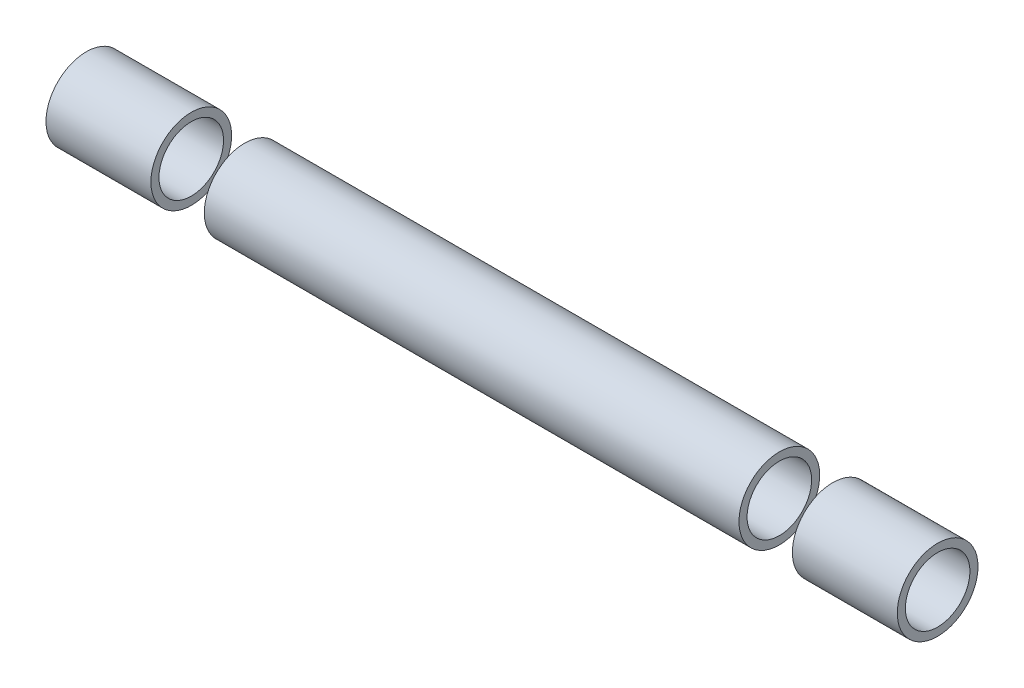
ISO-10303-21;
HEADER;
FILE_DESCRIPTION(('STEP AP214'),'2;1');
FILE_NAME('part.step','',(''),(''),'','','');
FILE_SCHEMA(('AUTOMOTIVE_DESIGN { 1 0 10303 214 1 1 1 1 }'));
ENDSEC;
DATA;
#1=APPLICATION_CONTEXT('core data for automotive mechanical design processes');
#2=APPLICATION_PROTOCOL_DEFINITION('international standard','automotive_design',2000,#1);
#3=PRODUCT_CONTEXT('',#1,'mechanical');
#4=PRODUCT('Part','Part','',(#3));
#5=PRODUCT_RELATED_PRODUCT_CATEGORY('part','',(#4));
#6=PRODUCT_DEFINITION_FORMATION('','',#4);
#7=PRODUCT_DEFINITION_CONTEXT('part definition',#1,'design');
#8=PRODUCT_DEFINITION('design','',#6,#7);
#9=PRODUCT_DEFINITION_SHAPE('','',#8);
#10=(LENGTH_UNIT() NAMED_UNIT(*) SI_UNIT(.MILLI.,.METRE.));
#11=(NAMED_UNIT(*) PLANE_ANGLE_UNIT() SI_UNIT($,.RADIAN.));
#12=(NAMED_UNIT(*) SI_UNIT($,.STERADIAN.) SOLID_ANGLE_UNIT());
#13=UNCERTAINTY_MEASURE_WITH_UNIT(LENGTH_MEASURE(1.E-05),#10,'distance_accuracy_value','');
#14=(GEOMETRIC_REPRESENTATION_CONTEXT(3) GLOBAL_UNCERTAINTY_ASSIGNED_CONTEXT((#13)) GLOBAL_UNIT_ASSIGNED_CONTEXT((#10,
#11,#12)) REPRESENTATION_CONTEXT('',''));
#15=CARTESIAN_POINT('',(0.,0.,0.));
#16=DIRECTION('',(0.,0.,1.));
#17=DIRECTION('',(1.,0.,0.));
#18=AXIS2_PLACEMENT_3D('',#15,#16,#17);
#19=CARTESIAN_POINT('',(167.4495,0.,0.));
#20=DIRECTION('',(-1.,0.,0.));
#21=DIRECTION('',(0.,0.,1.));
#22=AXIS2_PLACEMENT_3D('',#19,#20,#21);
#23=CYLINDRICAL_SURFACE('',#22,15.875);
#24=CARTESIAN_POINT('',(167.4495,0.,0.));
#25=DIRECTION('',(1.,0.,0.));
#26=DIRECTION('',(0.,0.,-1.));
#27=AXIS2_PLACEMENT_3D('',#24,#25,#26);
#28=CIRCLE('',#27,15.875);
#29=CARTESIAN_POINT('',(167.4495,0.,-15.875));
#30=VERTEX_POINT('',#29);
#31=EDGE_CURVE('E64',#30,#30,#28,.T.);
#32=ORIENTED_EDGE('',*,*,#31,.F.);
#33=EDGE_LOOP('',(#32));
#34=FACE_BOUND('',#33,.T.);
#35=CARTESIAN_POINT('',(126.1745,0.,0.));
#36=DIRECTION('',(1.,0.,0.));
#37=DIRECTION('',(0.,0.,-1.));
#38=AXIS2_PLACEMENT_3D('',#35,#36,#37);
#39=CIRCLE('',#38,15.875);
#40=CARTESIAN_POINT('',(126.1745,0.,-15.875));
#41=VERTEX_POINT('',#40);
#42=EDGE_CURVE('E55',#41,#41,#39,.T.);
#43=ORIENTED_EDGE('',*,*,#42,.T.);
#44=EDGE_LOOP('',(#43));
#45=FACE_BOUND('',#44,.T.);
#46=ADVANCED_FACE('F52',(#34,#45),#23,.T.);
#47=CARTESIAN_POINT('',(167.4495,0.,0.));
#48=DIRECTION('',(1.,0.,0.));
#49=DIRECTION('',(0.,0.,-1.));
#50=AXIS2_PLACEMENT_3D('',#47,#48,#49);
#51=PLANE('',#50);
#52=ORIENTED_EDGE('',*,*,#31,.T.);
#53=EDGE_LOOP('',(#52));
#54=FACE_BOUND('',#53,.T.);
#55=CARTESIAN_POINT('',(167.4495,0.,0.));
#56=DIRECTION('',(1.,0.,0.));
#57=DIRECTION('',(0.,0.,-1.));
#58=AXIS2_PLACEMENT_3D('',#55,#56,#57);
#59=CIRCLE('',#58,12.7);
#60=CARTESIAN_POINT('',(167.4495,0.,-12.7));
#61=VERTEX_POINT('',#60);
#62=EDGE_CURVE('E59',#61,#61,#59,.T.);
#63=ORIENTED_EDGE('',*,*,#62,.F.);
#64=EDGE_LOOP('',(#63));
#65=FACE_BOUND('',#64,.T.);
#66=ADVANCED_FACE('F80',(#54,#65),#51,.T.);
#67=CARTESIAN_POINT('',(167.4495,0.,0.));
#68=DIRECTION('',(-1.,0.,0.));
#69=DIRECTION('',(0.,0.,1.));
#70=AXIS2_PLACEMENT_3D('',#67,#68,#69);
#71=CYLINDRICAL_SURFACE('',#70,12.7);
#72=CARTESIAN_POINT('',(126.1745,0.,0.));
#73=DIRECTION('',(1.,0.,0.));
#74=DIRECTION('',(0.,0.,-1.));
#75=AXIS2_PLACEMENT_3D('',#72,#73,#74);
#76=CIRCLE('',#75,12.7);
#77=CARTESIAN_POINT('',(126.1745,0.,-12.7));
#78=VERTEX_POINT('',#77);
#79=EDGE_CURVE('E12',#78,#78,#76,.T.);
#80=ORIENTED_EDGE('',*,*,#79,.F.);
#81=EDGE_LOOP('',(#80));
#82=FACE_BOUND('',#81,.T.);
#83=ORIENTED_EDGE('',*,*,#62,.T.);
#84=EDGE_LOOP('',(#83));
#85=FACE_BOUND('',#84,.T.);
#86=ADVANCED_FACE('F75',(#82,#85),#71,.F.);
#87=CARTESIAN_POINT('',(126.1745,-15.875,-15.875));
#88=DIRECTION('',(1.,0.,0.));
#89=DIRECTION('',(0.,0.,-1.));
#90=AXIS2_PLACEMENT_3D('',#87,#88,#89);
#91=PLANE('',#90);
#92=ORIENTED_EDGE('',*,*,#79,.T.);
#93=EDGE_LOOP('',(#92));
#94=FACE_BOUND('',#93,.T.);
#95=ORIENTED_EDGE('',*,*,#42,.F.);
#96=EDGE_LOOP('',(#95));
#97=FACE_BOUND('',#96,.T.);
#98=ADVANCED_FACE('F73',(#94,#97),#91,.F.);
#99=CLOSED_SHELL('',(#46,#66,#86,#98));
#100=MANIFOLD_SOLID_BREP('B2',#99);
#101=CARTESIAN_POINT('',(167.4495,0.,0.));
#102=DIRECTION('',(-1.,0.,0.));
#103=DIRECTION('',(0.,0.,1.));
#104=AXIS2_PLACEMENT_3D('',#101,#102,#103);
#105=CYLINDRICAL_SURFACE('',#104,12.7);
#106=CARTESIAN_POINT('',(105.17450009,0.,0.));
#107=DIRECTION('',(-1.,0.,0.));
#108=DIRECTION('',(0.,-1.,0.));
#109=AXIS2_PLACEMENT_3D('',#106,#107,#108);
#110=CIRCLE('',#109,12.7);
#111=CARTESIAN_POINT('',(105.17450009,-12.7,0.));
#112=VERTEX_POINT('',#111);
#113=EDGE_CURVE('E140',#112,#112,#110,.T.);
#114=ORIENTED_EDGE('',*,*,#113,.F.);
#115=EDGE_LOOP('',(#114));
#116=FACE_BOUND('',#115,.T.);
#117=CARTESIAN_POINT('',(-105.17450009,0.,0.));
#118=DIRECTION('',(1.,0.,0.));
#119=DIRECTION('',(0.,1.,0.));
#120=AXIS2_PLACEMENT_3D('',#117,#118,#119);
#121=CIRCLE('',#120,12.7);
#122=CARTESIAN_POINT('',(-105.17450009,12.7,0.));
#123=VERTEX_POINT('',#122);
#124=EDGE_CURVE('E144',#123,#123,#121,.T.);
#125=ORIENTED_EDGE('',*,*,#124,.F.);
#126=EDGE_LOOP('',(#125));
#127=FACE_BOUND('',#126,.T.);
#128=ADVANCED_FACE('F129',(#116,#127),#105,.F.);
#129=CARTESIAN_POINT('',(-105.17450009,-15.875,-15.875));
#130=DIRECTION('',(1.,0.,0.));
#131=DIRECTION('',(0.,1.,0.));
#132=AXIS2_PLACEMENT_3D('',#129,#130,#131);
#133=PLANE('',#132);
#134=ORIENTED_EDGE('',*,*,#124,.T.);
#135=EDGE_LOOP('',(#134));
#136=FACE_BOUND('',#135,.T.);
#137=CARTESIAN_POINT('',(-105.17450009,0.,0.));
#138=DIRECTION('',(1.,0.,0.));
#139=DIRECTION('',(0.,1.,0.));
#140=AXIS2_PLACEMENT_3D('',#137,#138,#139);
#141=CIRCLE('',#140,15.875);
#142=CARTESIAN_POINT('',(-105.17450009,15.875,0.));
#143=VERTEX_POINT('',#142);
#144=EDGE_CURVE('E51',#143,#143,#141,.T.);
#145=ORIENTED_EDGE('',*,*,#144,.F.);
#146=EDGE_LOOP('',(#145));
#147=FACE_BOUND('',#146,.T.);
#148=ADVANCED_FACE('F150',(#136,#147),#133,.F.);
#149=CARTESIAN_POINT('',(105.17450009,-15.875,-15.875));
#150=DIRECTION('',(-1.,0.,0.));
#151=DIRECTION('',(0.,-1.,0.));
#152=AXIS2_PLACEMENT_3D('',#149,#150,#151);
#153=PLANE('',#152);
#154=ORIENTED_EDGE('',*,*,#113,.T.);
#155=EDGE_LOOP('',(#154));
#156=FACE_BOUND('',#155,.T.);
#157=CARTESIAN_POINT('',(105.17450009,0.,0.));
#158=DIRECTION('',(-1.,0.,0.));
#159=DIRECTION('',(0.,-1.,0.));
#160=AXIS2_PLACEMENT_3D('',#157,#158,#159);
#161=CIRCLE('',#160,15.875);
#162=CARTESIAN_POINT('',(105.17450009,-15.875,0.));
#163=VERTEX_POINT('',#162);
#164=EDGE_CURVE('E136',#163,#163,#161,.T.);
#165=ORIENTED_EDGE('',*,*,#164,.F.);
#166=EDGE_LOOP('',(#165));
#167=FACE_BOUND('',#166,.T.);
#168=ADVANCED_FACE('F158',(#156,#167),#153,.F.);
#169=CARTESIAN_POINT('',(167.4495,0.,0.));
#170=DIRECTION('',(-1.,0.,0.));
#171=DIRECTION('',(0.,0.,1.));
#172=AXIS2_PLACEMENT_3D('',#169,#170,#171);
#173=CYLINDRICAL_SURFACE('',#172,15.875);
#174=ORIENTED_EDGE('',*,*,#164,.T.);
#175=EDGE_LOOP('',(#174));
#176=FACE_BOUND('',#175,.T.);
#177=ORIENTED_EDGE('',*,*,#144,.T.);
#178=EDGE_LOOP('',(#177));
#179=FACE_BOUND('',#178,.T.);
#180=ADVANCED_FACE('F131',(#176,#179),#173,.T.);
#181=CLOSED_SHELL('',(#128,#148,#168,#180));
#182=MANIFOLD_SOLID_BREP('B7',#181);
#183=CARTESIAN_POINT('',(167.4495,0.,0.));
#184=DIRECTION('',(-1.,0.,0.));
#185=DIRECTION('',(0.,0.,1.));
#186=AXIS2_PLACEMENT_3D('',#183,#184,#185);
#187=CYLINDRICAL_SURFACE('',#186,15.875);
#188=CARTESIAN_POINT('',(-126.1745,0.,0.));
#189=DIRECTION('',(-1.,0.,0.));
#190=DIRECTION('',(0.,0.,1.));
#191=AXIS2_PLACEMENT_3D('',#188,#189,#190);
#192=CIRCLE('',#191,15.875);
#193=CARTESIAN_POINT('',(-126.1745,0.,15.875));
#194=VERTEX_POINT('',#193);
#195=EDGE_CURVE('E210',#194,#194,#192,.T.);
#196=ORIENTED_EDGE('',*,*,#195,.T.);
#197=EDGE_LOOP('',(#196));
#198=FACE_BOUND('',#197,.T.);
#199=CARTESIAN_POINT('',(-167.4495,0.,0.));
#200=DIRECTION('',(1.,0.,0.));
#201=DIRECTION('',(0.,0.,-1.));
#202=AXIS2_PLACEMENT_3D('',#199,#200,#201);
#203=CIRCLE('',#202,15.875);
#204=CARTESIAN_POINT('',(-167.4495,0.,-15.875));
#205=VERTEX_POINT('',#204);
#206=EDGE_CURVE('E128',#205,#205,#203,.T.);
#207=ORIENTED_EDGE('',*,*,#206,.T.);
#208=EDGE_LOOP('',(#207));
#209=FACE_BOUND('',#208,.T.);
#210=ADVANCED_FACE('F199',(#198,#209),#187,.T.);
#211=CARTESIAN_POINT('',(-167.4495,0.,0.));
#212=DIRECTION('',(1.,0.,0.));
#213=DIRECTION('',(0.,0.,-1.));
#214=AXIS2_PLACEMENT_3D('',#211,#212,#213);
#215=PLANE('',#214);
#216=ORIENTED_EDGE('',*,*,#206,.F.);
#217=EDGE_LOOP('',(#216));
#218=FACE_BOUND('',#217,.T.);
#219=CARTESIAN_POINT('',(-167.4495,0.,0.));
#220=DIRECTION('',(1.,0.,0.));
#221=DIRECTION('',(0.,0.,-1.));
#222=AXIS2_PLACEMENT_3D('',#219,#220,#221);
#223=CIRCLE('',#222,12.7);
#224=CARTESIAN_POINT('',(-167.4495,0.,-12.7));
#225=VERTEX_POINT('',#224);
#226=EDGE_CURVE('E206',#225,#225,#223,.T.);
#227=ORIENTED_EDGE('',*,*,#226,.T.);
#228=EDGE_LOOP('',(#227));
#229=FACE_BOUND('',#228,.T.);
#230=ADVANCED_FACE('F225',(#218,#229),#215,.F.);
#231=CARTESIAN_POINT('',(167.4495,0.,0.));
#232=DIRECTION('',(-1.,0.,0.));
#233=DIRECTION('',(0.,0.,1.));
#234=AXIS2_PLACEMENT_3D('',#231,#232,#233);
#235=CYLINDRICAL_SURFACE('',#234,12.7);
#236=CARTESIAN_POINT('',(-126.1745,0.,0.));
#237=DIRECTION('',(-1.,0.,0.));
#238=DIRECTION('',(0.,0.,1.));
#239=AXIS2_PLACEMENT_3D('',#236,#237,#238);
#240=CIRCLE('',#239,12.7);
#241=CARTESIAN_POINT('',(-126.1745,0.,12.7));
#242=VERTEX_POINT('',#241);
#243=EDGE_CURVE('E202',#242,#242,#240,.T.);
#244=ORIENTED_EDGE('',*,*,#243,.F.);
#245=EDGE_LOOP('',(#244));
#246=FACE_BOUND('',#245,.T.);
#247=ORIENTED_EDGE('',*,*,#226,.F.);
#248=EDGE_LOOP('',(#247));
#249=FACE_BOUND('',#248,.T.);
#250=ADVANCED_FACE('F222',(#246,#249),#235,.F.);
#251=CARTESIAN_POINT('',(-126.1745,-15.875,-15.875));
#252=DIRECTION('',(-1.,0.,0.));
#253=DIRECTION('',(0.,0.,1.));
#254=AXIS2_PLACEMENT_3D('',#251,#252,#253);
#255=PLANE('',#254);
#256=ORIENTED_EDGE('',*,*,#243,.T.);
#257=EDGE_LOOP('',(#256));
#258=FACE_BOUND('',#257,.T.);
#259=ORIENTED_EDGE('',*,*,#195,.F.);
#260=EDGE_LOOP('',(#259));
#261=FACE_BOUND('',#260,.T.);
#262=ADVANCED_FACE('F219',(#258,#261),#255,.F.);
#263=CLOSED_SHELL('',(#210,#230,#250,#262));
#264=MANIFOLD_SOLID_BREP('B46',#263);
#265=ADVANCED_BREP_SHAPE_REPRESENTATION('',(#18,#100,#182,#264),#14);
#266=SHAPE_DEFINITION_REPRESENTATION(#9,#265);
ENDSEC;
END-ISO-10303-21;
